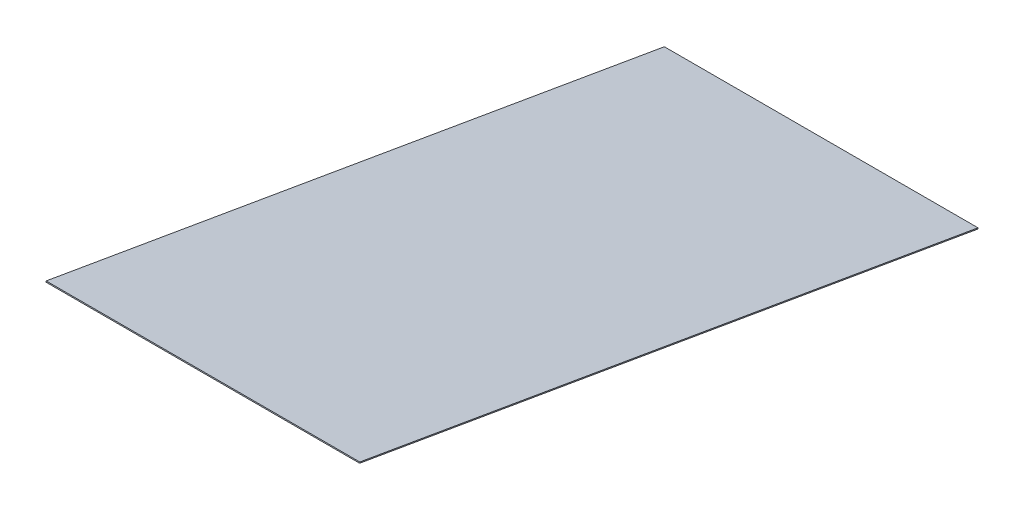
ISO-10303-21;
HEADER;
FILE_DESCRIPTION(('STEP AP214'),'2;1');
FILE_NAME('part.step','',(''),(''),'','','');
FILE_SCHEMA(('AUTOMOTIVE_DESIGN { 1 0 10303 214 1 1 1 1 }'));
ENDSEC;
DATA;
#1=APPLICATION_CONTEXT('core data for automotive mechanical design processes');
#2=APPLICATION_PROTOCOL_DEFINITION('international standard','automotive_design',2000,#1);
#3=PRODUCT_CONTEXT('',#1,'mechanical');
#4=PRODUCT('Part','Part','',(#3));
#5=PRODUCT_RELATED_PRODUCT_CATEGORY('part','',(#4));
#6=PRODUCT_DEFINITION_FORMATION('','',#4);
#7=PRODUCT_DEFINITION_CONTEXT('part definition',#1,'design');
#8=PRODUCT_DEFINITION('design','',#6,#7);
#9=PRODUCT_DEFINITION_SHAPE('','',#8);
#10=(LENGTH_UNIT() NAMED_UNIT(*) SI_UNIT(.MILLI.,.METRE.));
#11=(NAMED_UNIT(*) PLANE_ANGLE_UNIT() SI_UNIT($,.RADIAN.));
#12=(NAMED_UNIT(*) SI_UNIT($,.STERADIAN.) SOLID_ANGLE_UNIT());
#13=UNCERTAINTY_MEASURE_WITH_UNIT(LENGTH_MEASURE(1.E-05),#10,'distance_accuracy_value','');
#14=(GEOMETRIC_REPRESENTATION_CONTEXT(3) GLOBAL_UNCERTAINTY_ASSIGNED_CONTEXT((#13)) GLOBAL_UNIT_ASSIGNED_CONTEXT((#10,
#11,#12)) REPRESENTATION_CONTEXT('',''));
#15=CARTESIAN_POINT('',(0.,0.,0.));
#16=DIRECTION('',(0.,0.,1.));
#17=DIRECTION('',(1.,0.,0.));
#18=AXIS2_PLACEMENT_3D('',#15,#16,#17);
#19=CARTESIAN_POINT('',(0.,-10.294784682555,-1.78408360774737));
#20=DIRECTION('',(-1.,0.,0.));
#21=DIRECTION('',(0.,0.169439179137223,0.985540645825074));
#22=AXIS2_PLACEMENT_3D('',#19,#20,#21);
#23=PLANE('',#22);
#24=DIRECTION('',(0.,0.985540645825074,-0.169439179137223));
#25=VECTOR('',#24,1.);
#26=CARTESIAN_POINT('',(0.,-10.294784682555,-1.78408360774737));
#27=LINE('',#26,#25);
#28=CARTESIAN_POINT('',(0.,-10.3933387471375,-1.76713968983365));
#29=VERTEX_POINT('',#28);
#30=CARTESIAN_POINT('',(0.,-10.294784682555,-1.78408360774737));
#31=VERTEX_POINT('',#30);
#32=EDGE_CURVE('E11',#29,#31,#27,.T.);
#33=ORIENTED_EDGE('',*,*,#32,.F.);
#34=DIRECTION('',(0.,0.169439179137223,0.985540645825074));
#35=VECTOR('',#34,1.);
#36=CARTESIAN_POINT('',(0.,-10.3933387471375,-1.76713968983365));
#37=LINE('',#36,#35);
#38=CARTESIAN_POINT('',(0.,-0.226987998904145,57.3652990596708));
#39=VERTEX_POINT('',#38);
#40=EDGE_CURVE('E88',#29,#39,#37,.T.);
#41=ORIENTED_EDGE('',*,*,#40,.T.);
#42=DIRECTION('',(0.,0.985540645825074,-0.169439179137223));
#43=VECTOR('',#42,1.);
#44=CARTESIAN_POINT('',(0.,-0.128433934321636,57.3483551417571));
#45=LINE('',#44,#43);
#46=CARTESIAN_POINT('',(0.,-0.128433934321636,57.3483551417571));
#47=VERTEX_POINT('',#46);
#48=EDGE_CURVE('E43',#39,#47,#45,.T.);
#49=ORIENTED_EDGE('',*,*,#48,.T.);
#50=DIRECTION('',(0.,0.169439179137223,0.985540645825074));
#51=VECTOR('',#50,1.);
#52=CARTESIAN_POINT('',(0.,-10.294784682555,-1.78408360774737));
#53=LINE('',#52,#51);
#54=EDGE_CURVE('E101',#31,#47,#53,.T.);
#55=ORIENTED_EDGE('',*,*,#54,.F.);
#56=EDGE_LOOP('',(#33,#41,#49,#55));
#57=FACE_BOUND('',#56,.T.);
#58=ADVANCED_FACE('F33',(#57),#23,.T.);
#59=CARTESIAN_POINT('',(0.,-0.128433934321636,57.3483551417571));
#60=DIRECTION('',(0.,0.169439179137223,0.985540645825074));
#61=DIRECTION('',(1.,0.,0.));
#62=AXIS2_PLACEMENT_3D('',#59,#60,#61);
#63=PLANE('',#62);
#64=ORIENTED_EDGE('',*,*,#48,.F.);
#65=DIRECTION('',(1.,0.,0.));
#66=VECTOR('',#65,1.);
#67=CARTESIAN_POINT('',(0.,-0.226987998904145,57.3652990596708));
#68=LINE('',#67,#66);
#69=CARTESIAN_POINT('',(30.,-0.226987998904145,57.3652990596708));
#70=VERTEX_POINT('',#69);
#71=EDGE_CURVE('E95',#39,#70,#68,.T.);
#72=ORIENTED_EDGE('',*,*,#71,.T.);
#73=DIRECTION('',(0.,0.985540645825074,-0.169439179137223));
#74=VECTOR('',#73,1.);
#75=CARTESIAN_POINT('',(30.,-0.128433934321636,57.3483551417571));
#76=LINE('',#75,#74);
#77=CARTESIAN_POINT('',(30.,-0.128433934321636,57.3483551417571));
#78=VERTEX_POINT('',#77);
#79=EDGE_CURVE('E51',#70,#78,#76,.T.);
#80=ORIENTED_EDGE('',*,*,#79,.T.);
#81=DIRECTION('',(1.,0.,0.));
#82=VECTOR('',#81,1.);
#83=CARTESIAN_POINT('',(0.,-0.128433934321636,57.3483551417571));
#84=LINE('',#83,#82);
#85=EDGE_CURVE('E82',#47,#78,#84,.T.);
#86=ORIENTED_EDGE('',*,*,#85,.F.);
#87=EDGE_LOOP('',(#64,#72,#80,#86));
#88=FACE_BOUND('',#87,.T.);
#89=ADVANCED_FACE('F105',(#88),#63,.T.);
#90=CARTESIAN_POINT('',(30.,-10.294784682555,-1.78408360774737));
#91=DIRECTION('',(-1.,0.,0.));
#92=DIRECTION('',(0.,0.169439179137223,0.985540645825074));
#93=AXIS2_PLACEMENT_3D('',#90,#91,#92);
#94=PLANE('',#93);
#95=ORIENTED_EDGE('',*,*,#79,.F.);
#96=DIRECTION('',(0.,0.169439179137223,0.985540645825074));
#97=VECTOR('',#96,1.);
#98=CARTESIAN_POINT('',(30.,-10.3933387471375,-1.76713968983365));
#99=LINE('',#98,#97);
#100=CARTESIAN_POINT('',(30.,-10.3933387471375,-1.76713968983365));
#101=VERTEX_POINT('',#100);
#102=EDGE_CURVE('E87',#101,#70,#99,.T.);
#103=ORIENTED_EDGE('',*,*,#102,.F.);
#104=DIRECTION('',(0.,0.985540645825074,-0.169439179137223));
#105=VECTOR('',#104,1.);
#106=CARTESIAN_POINT('',(30.,-10.294784682555,-1.78408360774737));
#107=LINE('',#106,#105);
#108=CARTESIAN_POINT('',(30.,-10.294784682555,-1.78408360774737));
#109=VERTEX_POINT('',#108);
#110=EDGE_CURVE('E37',#101,#109,#107,.T.);
#111=ORIENTED_EDGE('',*,*,#110,.T.);
#112=DIRECTION('',(0.,0.169439179137223,0.985540645825074));
#113=VECTOR('',#112,1.);
#114=CARTESIAN_POINT('',(30.,-10.294784682555,-1.78408360774737));
#115=LINE('',#114,#113);
#116=EDGE_CURVE('E97',#109,#78,#115,.T.);
#117=ORIENTED_EDGE('',*,*,#116,.T.);
#118=EDGE_LOOP('',(#95,#103,#111,#117));
#119=FACE_BOUND('',#118,.T.);
#120=ADVANCED_FACE('F90',(#119),#94,.F.);
#121=CARTESIAN_POINT('',(0.,-10.294784682555,-1.78408360774737));
#122=DIRECTION('',(0.,0.169439179137223,0.985540645825074));
#123=DIRECTION('',(1.,0.,0.));
#124=AXIS2_PLACEMENT_3D('',#121,#122,#123);
#125=PLANE('',#124);
#126=DIRECTION('',(1.,0.,0.));
#127=VECTOR('',#126,1.);
#128=CARTESIAN_POINT('',(0.,-10.3933387471375,-1.76713968983365));
#129=LINE('',#128,#127);
#130=EDGE_CURVE('E76',#29,#101,#129,.T.);
#131=ORIENTED_EDGE('',*,*,#130,.F.);
#132=ORIENTED_EDGE('',*,*,#32,.T.);
#133=DIRECTION('',(1.,0.,0.));
#134=VECTOR('',#133,1.);
#135=CARTESIAN_POINT('',(0.,-10.294784682555,-1.78408360774737));
#136=LINE('',#135,#134);
#137=EDGE_CURVE('E78',#31,#109,#136,.T.);
#138=ORIENTED_EDGE('',*,*,#137,.T.);
#139=ORIENTED_EDGE('',*,*,#110,.F.);
#140=EDGE_LOOP('',(#131,#132,#138,#139));
#141=FACE_BOUND('',#140,.T.);
#142=ADVANCED_FACE('F35',(#141),#125,.F.);
#143=CARTESIAN_POINT('',(0.,-10.294784682555,-1.78408360774737));
#144=DIRECTION('',(0.,0.985540645825074,-0.169439179137223));
#145=DIRECTION('',(0.,0.169439179137223,0.985540645825074));
#146=AXIS2_PLACEMENT_3D('',#143,#144,#145);
#147=PLANE('',#146);
#148=ORIENTED_EDGE('',*,*,#116,.F.);
#149=ORIENTED_EDGE('',*,*,#137,.F.);
#150=ORIENTED_EDGE('',*,*,#54,.T.);
#151=ORIENTED_EDGE('',*,*,#85,.T.);
#152=EDGE_LOOP('',(#148,#149,#150,#151));
#153=FACE_BOUND('',#152,.T.);
#154=ADVANCED_FACE('F104',(#153),#147,.T.);
#155=CARTESIAN_POINT('',(0.,-10.3933387471375,-1.76713968983365));
#156=DIRECTION('',(0.,0.985540645825074,-0.169439179137223));
#157=DIRECTION('',(0.,0.169439179137223,0.985540645825074));
#158=AXIS2_PLACEMENT_3D('',#155,#156,#157);
#159=PLANE('',#158);
#160=ORIENTED_EDGE('',*,*,#102,.T.);
#161=ORIENTED_EDGE('',*,*,#71,.F.);
#162=ORIENTED_EDGE('',*,*,#40,.F.);
#163=ORIENTED_EDGE('',*,*,#130,.T.);
#164=EDGE_LOOP('',(#160,#161,#162,#163));
#165=FACE_BOUND('',#164,.T.);
#166=ADVANCED_FACE('F85',(#165),#159,.F.);
#167=CLOSED_SHELL('',(#58,#89,#120,#142,#154,#166));
#168=MANIFOLD_SOLID_BREP('B2',#167);
#169=ADVANCED_BREP_SHAPE_REPRESENTATION('',(#18,#168),#14);
#170=SHAPE_DEFINITION_REPRESENTATION(#9,#169);
ENDSEC;
END-ISO-10303-21;
